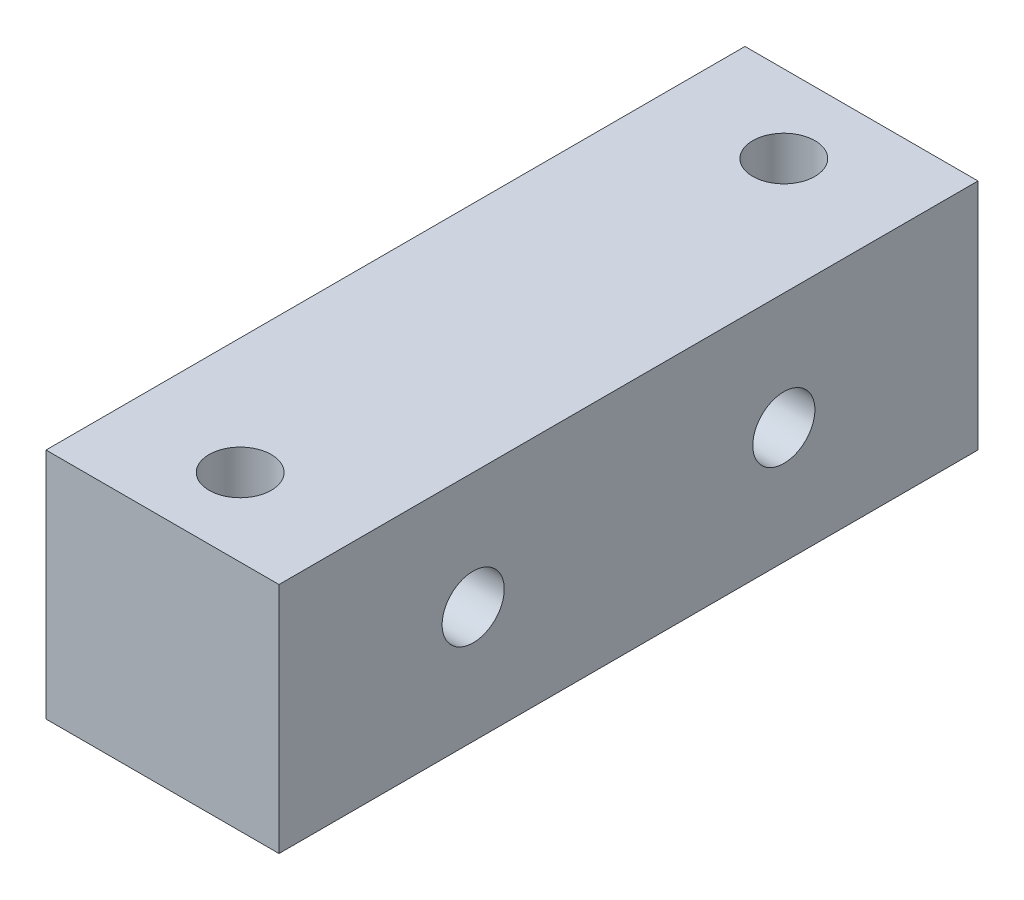
ISO-10303-21;
HEADER;
FILE_DESCRIPTION(('STEP AP214'),'2;1');
FILE_NAME('part.step','',(''),(''),'','','');
FILE_SCHEMA(('AUTOMOTIVE_DESIGN { 1 0 10303 214 1 1 1 1 }'));
ENDSEC;
DATA;
#1=APPLICATION_CONTEXT('core data for automotive mechanical design processes');
#2=APPLICATION_PROTOCOL_DEFINITION('international standard','automotive_design',2000,#1);
#3=PRODUCT_CONTEXT('',#1,'mechanical');
#4=PRODUCT('Part','Part','',(#3));
#5=PRODUCT_RELATED_PRODUCT_CATEGORY('part','',(#4));
#6=PRODUCT_DEFINITION_FORMATION('','',#4);
#7=PRODUCT_DEFINITION_CONTEXT('part definition',#1,'design');
#8=PRODUCT_DEFINITION('design','',#6,#7);
#9=PRODUCT_DEFINITION_SHAPE('','',#8);
#10=(LENGTH_UNIT() NAMED_UNIT(*) SI_UNIT(.MILLI.,.METRE.));
#11=(NAMED_UNIT(*) PLANE_ANGLE_UNIT() SI_UNIT($,.RADIAN.));
#12=(NAMED_UNIT(*) SI_UNIT($,.STERADIAN.) SOLID_ANGLE_UNIT());
#13=UNCERTAINTY_MEASURE_WITH_UNIT(LENGTH_MEASURE(1.E-05),#10,'distance_accuracy_value','');
#14=(GEOMETRIC_REPRESENTATION_CONTEXT(3) GLOBAL_UNCERTAINTY_ASSIGNED_CONTEXT((#13)) GLOBAL_UNIT_ASSIGNED_CONTEXT((#10,
#11,#12)) REPRESENTATION_CONTEXT('',''));
#15=CARTESIAN_POINT('',(0.,0.,0.));
#16=DIRECTION('',(0.,0.,1.));
#17=DIRECTION('',(1.,0.,0.));
#18=AXIS2_PLACEMENT_3D('',#15,#16,#17);
#19=CARTESIAN_POINT('',(15.,30.,45.));
#20=DIRECTION('',(-1.,0.,0.));
#21=DIRECTION('',(0.,0.,1.));
#22=AXIS2_PLACEMENT_3D('',#19,#20,#21);
#23=PLANE('',#22);
#24=CARTESIAN_POINT('',(15.,15.,-20.));
#25=DIRECTION('',(-1.,0.,0.));
#26=DIRECTION('',(0.,0.,1.));
#27=AXIS2_PLACEMENT_3D('',#24,#25,#26);
#28=CIRCLE('',#27,4.);
#29=CARTESIAN_POINT('',(15.,15.,-16.));
#30=VERTEX_POINT('',#29);
#31=EDGE_CURVE('E111',#30,#30,#28,.T.);
#32=ORIENTED_EDGE('',*,*,#31,.T.);
#33=EDGE_LOOP('',(#32));
#34=FACE_BOUND('',#33,.T.);
#35=CARTESIAN_POINT('',(15.,15.,20.));
#36=DIRECTION('',(-1.,0.,0.));
#37=DIRECTION('',(0.,0.,-1.));
#38=AXIS2_PLACEMENT_3D('',#35,#36,#37);
#39=CIRCLE('',#38,4.);
#40=CARTESIAN_POINT('',(15.,15.,24.));
#41=VERTEX_POINT('',#40);
#42=EDGE_CURVE('E132',#41,#41,#39,.T.);
#43=ORIENTED_EDGE('',*,*,#42,.T.);
#44=EDGE_LOOP('',(#43));
#45=FACE_BOUND('',#44,.T.);
#46=DIRECTION('',(0.,0.,-1.));
#47=VECTOR('',#46,1.);
#48=CARTESIAN_POINT('',(15.,0.,45.));
#49=LINE('',#48,#47);
#50=CARTESIAN_POINT('',(15.,0.,45.));
#51=VERTEX_POINT('',#50);
#52=CARTESIAN_POINT('',(15.,0.,-45.));
#53=VERTEX_POINT('',#52);
#54=EDGE_CURVE('E107',#51,#53,#49,.T.);
#55=ORIENTED_EDGE('',*,*,#54,.T.);
#56=DIRECTION('',(0.,-1.,0.));
#57=VECTOR('',#56,1.);
#58=CARTESIAN_POINT('',(15.,30.,-45.));
#59=LINE('',#58,#57);
#60=CARTESIAN_POINT('',(15.,30.,-45.));
#61=VERTEX_POINT('',#60);
#62=EDGE_CURVE('E11',#61,#53,#59,.T.);
#63=ORIENTED_EDGE('',*,*,#62,.F.);
#64=DIRECTION('',(0.,0.,-1.));
#65=VECTOR('',#64,1.);
#66=CARTESIAN_POINT('',(15.,30.,45.));
#67=LINE('',#66,#65);
#68=CARTESIAN_POINT('',(15.,30.,45.));
#69=VERTEX_POINT('',#68);
#70=EDGE_CURVE('E91',#69,#61,#67,.T.);
#71=ORIENTED_EDGE('',*,*,#70,.F.);
#72=DIRECTION('',(0.,-1.,0.));
#73=VECTOR('',#72,1.);
#74=CARTESIAN_POINT('',(15.,30.,45.));
#75=LINE('',#74,#73);
#76=EDGE_CURVE('E103',#69,#51,#75,.T.);
#77=ORIENTED_EDGE('',*,*,#76,.T.);
#78=EDGE_LOOP('',(#55,#63,#71,#77));
#79=FACE_BOUND('',#78,.T.);
#80=ADVANCED_FACE('F39',(#34,#45,#79),#23,.F.);
#81=CARTESIAN_POINT('',(-15.,30.,-45.));
#82=DIRECTION('',(0.,0.,1.));
#83=DIRECTION('',(1.,0.,0.));
#84=AXIS2_PLACEMENT_3D('',#81,#82,#83);
#85=PLANE('',#84);
#86=DIRECTION('',(-1.,0.,0.));
#87=VECTOR('',#86,1.);
#88=CARTESIAN_POINT('',(-15.,0.,-45.));
#89=LINE('',#88,#87);
#90=CARTESIAN_POINT('',(-15.,0.,-45.));
#91=VERTEX_POINT('',#90);
#92=EDGE_CURVE('E96',#53,#91,#89,.T.);
#93=ORIENTED_EDGE('',*,*,#92,.T.);
#94=DIRECTION('',(0.,-1.,0.));
#95=VECTOR('',#94,1.);
#96=CARTESIAN_POINT('',(-15.,30.,-45.));
#97=LINE('',#96,#95);
#98=CARTESIAN_POINT('',(-15.,30.,-45.));
#99=VERTEX_POINT('',#98);
#100=EDGE_CURVE('E48',#99,#91,#97,.T.);
#101=ORIENTED_EDGE('',*,*,#100,.F.);
#102=DIRECTION('',(-1.,0.,0.));
#103=VECTOR('',#102,1.);
#104=CARTESIAN_POINT('',(-15.,30.,-45.));
#105=LINE('',#104,#103);
#106=EDGE_CURVE('E86',#61,#99,#105,.T.);
#107=ORIENTED_EDGE('',*,*,#106,.F.);
#108=ORIENTED_EDGE('',*,*,#62,.T.);
#109=EDGE_LOOP('',(#93,#101,#107,#108));
#110=FACE_BOUND('',#109,.T.);
#111=ADVANCED_FACE('F95',(#110),#85,.F.);
#112=CARTESIAN_POINT('',(-15.,30.,45.));
#113=DIRECTION('',(1.,0.,0.));
#114=DIRECTION('',(0.,0.,-1.));
#115=AXIS2_PLACEMENT_3D('',#112,#113,#114);
#116=PLANE('',#115);
#117=CARTESIAN_POINT('',(-15.,15.,-20.));
#118=DIRECTION('',(-1.,0.,0.));
#119=DIRECTION('',(0.,0.,1.));
#120=AXIS2_PLACEMENT_3D('',#117,#118,#119);
#121=CIRCLE('',#120,4.);
#122=CARTESIAN_POINT('',(-15.,15.,-16.));
#123=VERTEX_POINT('',#122);
#124=EDGE_CURVE('E137',#123,#123,#121,.T.);
#125=ORIENTED_EDGE('',*,*,#124,.F.);
#126=EDGE_LOOP('',(#125));
#127=FACE_BOUND('',#126,.T.);
#128=CARTESIAN_POINT('',(-15.,15.,20.));
#129=DIRECTION('',(-1.,0.,0.));
#130=DIRECTION('',(0.,0.,-1.));
#131=AXIS2_PLACEMENT_3D('',#128,#129,#130);
#132=CIRCLE('',#131,4.);
#133=CARTESIAN_POINT('',(-15.,15.,24.));
#134=VERTEX_POINT('',#133);
#135=EDGE_CURVE('E128',#134,#134,#132,.T.);
#136=ORIENTED_EDGE('',*,*,#135,.F.);
#137=EDGE_LOOP('',(#136));
#138=FACE_BOUND('',#137,.T.);
#139=DIRECTION('',(0.,0.,1.));
#140=VECTOR('',#139,1.);
#141=CARTESIAN_POINT('',(-15.,0.,45.));
#142=LINE('',#141,#140);
#143=CARTESIAN_POINT('',(-15.,0.,45.));
#144=VERTEX_POINT('',#143);
#145=EDGE_CURVE('E73',#91,#144,#142,.T.);
#146=ORIENTED_EDGE('',*,*,#145,.T.);
#147=DIRECTION('',(0.,-1.,0.));
#148=VECTOR('',#147,1.);
#149=CARTESIAN_POINT('',(-15.,30.,45.));
#150=LINE('',#149,#148);
#151=CARTESIAN_POINT('',(-15.,30.,45.));
#152=VERTEX_POINT('',#151);
#153=EDGE_CURVE('E98',#152,#144,#150,.T.);
#154=ORIENTED_EDGE('',*,*,#153,.F.);
#155=DIRECTION('',(0.,0.,1.));
#156=VECTOR('',#155,1.);
#157=CARTESIAN_POINT('',(-15.,30.,45.));
#158=LINE('',#157,#156);
#159=EDGE_CURVE('E89',#99,#152,#158,.T.);
#160=ORIENTED_EDGE('',*,*,#159,.F.);
#161=ORIENTED_EDGE('',*,*,#100,.T.);
#162=EDGE_LOOP('',(#146,#154,#160,#161));
#163=FACE_BOUND('',#162,.T.);
#164=ADVANCED_FACE('F99',(#127,#138,#163),#116,.F.);
#165=CARTESIAN_POINT('',(-15.,30.,45.));
#166=DIRECTION('',(0.,0.,-1.));
#167=DIRECTION('',(-1.,0.,0.));
#168=AXIS2_PLACEMENT_3D('',#165,#166,#167);
#169=PLANE('',#168);
#170=DIRECTION('',(1.,0.,0.));
#171=VECTOR('',#170,1.);
#172=CARTESIAN_POINT('',(-15.,0.,45.));
#173=LINE('',#172,#171);
#174=EDGE_CURVE('E79',#144,#51,#173,.T.);
#175=ORIENTED_EDGE('',*,*,#174,.T.);
#176=ORIENTED_EDGE('',*,*,#76,.F.);
#177=DIRECTION('',(1.,0.,0.));
#178=VECTOR('',#177,1.);
#179=CARTESIAN_POINT('',(-15.,30.,45.));
#180=LINE('',#179,#178);
#181=EDGE_CURVE('E56',#152,#69,#180,.T.);
#182=ORIENTED_EDGE('',*,*,#181,.F.);
#183=ORIENTED_EDGE('',*,*,#153,.T.);
#184=EDGE_LOOP('',(#175,#176,#182,#183));
#185=FACE_BOUND('',#184,.T.);
#186=ADVANCED_FACE('F121',(#185),#169,.F.);
#187=CARTESIAN_POINT('',(0.,30.,0.));
#188=DIRECTION('',(0.,-1.,0.));
#189=DIRECTION('',(0.,0.,-1.));
#190=AXIS2_PLACEMENT_3D('',#187,#188,#189);
#191=PLANE('',#190);
#192=CARTESIAN_POINT('',(0.,30.,-35.));
#193=DIRECTION('',(0.,1.,0.));
#194=DIRECTION('',(0.,0.,1.));
#195=AXIS2_PLACEMENT_3D('',#192,#193,#194);
#196=CIRCLE('',#195,4.);
#197=CARTESIAN_POINT('',(0.,30.,-31.));
#198=VERTEX_POINT('',#197);
#199=EDGE_CURVE('E152',#198,#198,#196,.T.);
#200=ORIENTED_EDGE('',*,*,#199,.F.);
#201=EDGE_LOOP('',(#200));
#202=FACE_BOUND('',#201,.T.);
#203=CARTESIAN_POINT('',(0.,30.,35.));
#204=DIRECTION('',(0.,1.,0.));
#205=DIRECTION('',(0.,0.,-1.));
#206=AXIS2_PLACEMENT_3D('',#203,#204,#205);
#207=CIRCLE('',#206,4.);
#208=CARTESIAN_POINT('',(0.,30.,31.));
#209=VERTEX_POINT('',#208);
#210=EDGE_CURVE('E144',#209,#209,#207,.T.);
#211=ORIENTED_EDGE('',*,*,#210,.F.);
#212=EDGE_LOOP('',(#211));
#213=FACE_BOUND('',#212,.T.);
#214=ORIENTED_EDGE('',*,*,#70,.T.);
#215=ORIENTED_EDGE('',*,*,#106,.T.);
#216=ORIENTED_EDGE('',*,*,#159,.T.);
#217=ORIENTED_EDGE('',*,*,#181,.T.);
#218=EDGE_LOOP('',(#214,#215,#216,#217));
#219=FACE_BOUND('',#218,.T.);
#220=ADVANCED_FACE('F87',(#202,#213,#219),#191,.F.);
#221=CARTESIAN_POINT('',(0.,0.,0.));
#222=DIRECTION('',(0.,-1.,0.));
#223=DIRECTION('',(0.,0.,-1.));
#224=AXIS2_PLACEMENT_3D('',#221,#222,#223);
#225=PLANE('',#224);
#226=CARTESIAN_POINT('',(0.,0.,-35.));
#227=DIRECTION('',(0.,1.,0.));
#228=DIRECTION('',(0.,0.,1.));
#229=AXIS2_PLACEMENT_3D('',#226,#227,#228);
#230=CIRCLE('',#229,4.);
#231=CARTESIAN_POINT('',(0.,0.,-31.));
#232=VERTEX_POINT('',#231);
#233=EDGE_CURVE('E133',#232,#232,#230,.T.);
#234=ORIENTED_EDGE('',*,*,#233,.T.);
#235=EDGE_LOOP('',(#234));
#236=FACE_BOUND('',#235,.T.);
#237=CARTESIAN_POINT('',(0.,0.,35.));
#238=DIRECTION('',(0.,1.,0.));
#239=DIRECTION('',(0.,0.,-1.));
#240=AXIS2_PLACEMENT_3D('',#237,#238,#239);
#241=CIRCLE('',#240,4.);
#242=CARTESIAN_POINT('',(0.,0.,31.));
#243=VERTEX_POINT('',#242);
#244=EDGE_CURVE('E148',#243,#243,#241,.T.);
#245=ORIENTED_EDGE('',*,*,#244,.T.);
#246=EDGE_LOOP('',(#245));
#247=FACE_BOUND('',#246,.T.);
#248=ORIENTED_EDGE('',*,*,#54,.F.);
#249=ORIENTED_EDGE('',*,*,#174,.F.);
#250=ORIENTED_EDGE('',*,*,#145,.F.);
#251=ORIENTED_EDGE('',*,*,#92,.F.);
#252=EDGE_LOOP('',(#248,#249,#250,#251));
#253=FACE_BOUND('',#252,.T.);
#254=ADVANCED_FACE('F124',(#236,#247,#253),#225,.T.);
#255=CARTESIAN_POINT('',(15.,15.,20.));
#256=DIRECTION('',(-1.,0.,0.));
#257=DIRECTION('',(0.,0.,1.));
#258=AXIS2_PLACEMENT_3D('',#255,#256,#257);
#259=CYLINDRICAL_SURFACE('',#258,4.);
#260=CARTESIAN_POINT('',(15.,15.,24.));
#261=CARTESIAN_POINT('',(14.6875,15.,24.));
#262=CARTESIAN_POINT('',(14.375,15.,24.));
#263=CARTESIAN_POINT('',(13.75,15.,24.));
#264=CARTESIAN_POINT('',(13.4375,15.,24.));
#265=CARTESIAN_POINT('',(12.8125,15.,24.));
#266=CARTESIAN_POINT('',(12.5,15.,24.));
#267=CARTESIAN_POINT('',(11.875,15.,24.));
#268=CARTESIAN_POINT('',(11.5625,15.,24.));
#269=CARTESIAN_POINT('',(10.9375,15.,24.));
#270=CARTESIAN_POINT('',(10.625,15.,24.));
#271=CARTESIAN_POINT('',(10.,15.,24.));
#272=CARTESIAN_POINT('',(9.6875,15.,24.));
#273=CARTESIAN_POINT('',(9.0625,15.,24.));
#274=CARTESIAN_POINT('',(8.75,15.,24.));
#275=CARTESIAN_POINT('',(8.125,15.,24.));
#276=CARTESIAN_POINT('',(7.8125,15.,24.));
#277=CARTESIAN_POINT('',(7.1875,15.,24.));
#278=CARTESIAN_POINT('',(6.875,15.,24.));
#279=CARTESIAN_POINT('',(6.25,15.,24.));
#280=CARTESIAN_POINT('',(5.9375,15.,24.));
#281=CARTESIAN_POINT('',(5.3125,15.,24.));
#282=CARTESIAN_POINT('',(5.,15.,24.));
#283=CARTESIAN_POINT('',(4.375,15.,24.));
#284=CARTESIAN_POINT('',(4.06249999999999,15.,24.));
#285=CARTESIAN_POINT('',(3.43749999999999,15.,24.));
#286=CARTESIAN_POINT('',(3.125,15.,24.));
#287=CARTESIAN_POINT('',(2.5,15.,24.));
#288=CARTESIAN_POINT('',(2.1875,15.,24.));
#289=CARTESIAN_POINT('',(1.5625,15.,24.));
#290=CARTESIAN_POINT('',(1.25,15.,24.));
#291=CARTESIAN_POINT('',(0.624999999999995,15.,24.));
#292=CARTESIAN_POINT('',(0.312499999999995,15.,24.));
#293=CARTESIAN_POINT('',(-0.312500000000005,15.,24.));
#294=CARTESIAN_POINT('',(-0.625000000000005,15.,24.));
#295=CARTESIAN_POINT('',(-1.25,15.,24.));
#296=CARTESIAN_POINT('',(-1.5625,15.,24.));
#297=CARTESIAN_POINT('',(-2.1875,15.,24.));
#298=CARTESIAN_POINT('',(-2.5,15.,24.));
#299=CARTESIAN_POINT('',(-3.125,15.,24.));
#300=CARTESIAN_POINT('',(-3.4375,15.,24.));
#301=CARTESIAN_POINT('',(-4.0625,15.,24.));
#302=CARTESIAN_POINT('',(-4.375,15.,24.));
#303=CARTESIAN_POINT('',(-5.,15.,24.));
#304=CARTESIAN_POINT('',(-5.3125,15.,24.));
#305=CARTESIAN_POINT('',(-5.93750000000001,15.,24.));
#306=CARTESIAN_POINT('',(-6.25000000000001,15.,24.));
#307=CARTESIAN_POINT('',(-6.87500000000001,15.,24.));
#308=CARTESIAN_POINT('',(-7.18750000000001,15.,24.));
#309=CARTESIAN_POINT('',(-7.81250000000001,15.,24.));
#310=CARTESIAN_POINT('',(-8.12500000000001,15.,24.));
#311=CARTESIAN_POINT('',(-8.75,15.,24.));
#312=CARTESIAN_POINT('',(-9.06250000000001,15.,24.));
#313=CARTESIAN_POINT('',(-9.68750000000001,15.,24.));
#314=CARTESIAN_POINT('',(-10.,15.,24.));
#315=CARTESIAN_POINT('',(-10.625,15.,24.));
#316=CARTESIAN_POINT('',(-10.9375,15.,24.));
#317=CARTESIAN_POINT('',(-11.5625,15.,24.));
#318=CARTESIAN_POINT('',(-11.875,15.,24.));
#319=CARTESIAN_POINT('',(-12.5,15.,24.));
#320=CARTESIAN_POINT('',(-12.8125,15.,24.));
#321=CARTESIAN_POINT('',(-13.4375,15.,24.));
#322=CARTESIAN_POINT('',(-13.75,15.,24.));
#323=CARTESIAN_POINT('',(-14.375,15.,24.));
#324=CARTESIAN_POINT('',(-14.6875,15.,24.));
#325=CARTESIAN_POINT('',(-15.,15.,24.));
#326=B_SPLINE_CURVE_WITH_KNOTS('',3,(#260,#261,#262,#263,#264,#265,#266,#267,#268,#269,#270,
#271,#272,#273,#274,#275,#276,#277,#278,#279,#280,#281,#282,#283,#284,#285,#286,#287,#288,#289,
#290,#291,#292,#293,#294,#295,#296,#297,#298,#299,#300,#301,#302,#303,#304,#305,#306,#307,#308,
#309,#310,#311,#312,#313,#314,#315,#316,#317,#318,#319,#320,#321,#322,#323,#324,#325),
.UNSPECIFIED.,.F.,.F.,(4,2,2,2,2,2,2,2,2,2,2,2,2,2,2,2,2,2,2,2,2,2,2,2,2,2,2,2,2,2,2,2,4),(0.,
0.937499999999999,1.875,2.8125,3.75,4.6875,5.625,6.5625,7.5,8.4375,9.375,10.3125,11.25,12.1875,
13.125,14.0625,15.,15.9375,16.875,17.8125,18.75,19.6875,20.625,21.5625,22.5,23.4375,24.375,
25.3125,26.25,27.1875,28.125,29.0625,30.),.UNSPECIFIED.);
#327=EDGE_CURVE('BSEAM181',#41,#134,#326,.T.);
#328=ORIENTED_EDGE('',*,*,#42,.F.);
#329=ORIENTED_EDGE('',*,*,#135,.T.);
#330=ORIENTED_EDGE('',*,*,#327,.T.);
#331=ORIENTED_EDGE('',*,*,#327,.F.);
#332=EDGE_LOOP('',(#328,#330,#329,#331));
#333=FACE_BOUND('',#332,.T.);
#334=ADVANCED_FACE('F181',(#333),#259,.F.);
#335=CARTESIAN_POINT('',(15.,15.,-20.));
#336=DIRECTION('',(-1.,0.,0.));
#337=DIRECTION('',(0.,0.,1.));
#338=AXIS2_PLACEMENT_3D('',#335,#336,#337);
#339=CYLINDRICAL_SURFACE('',#338,4.);
#340=CARTESIAN_POINT('',(15.,15.,-16.));
#341=CARTESIAN_POINT('',(14.6875,15.,-16.));
#342=CARTESIAN_POINT('',(14.375,15.,-16.));
#343=CARTESIAN_POINT('',(13.75,15.,-16.));
#344=CARTESIAN_POINT('',(13.4375,15.,-16.));
#345=CARTESIAN_POINT('',(12.8125,15.,-16.));
#346=CARTESIAN_POINT('',(12.5,15.,-16.));
#347=CARTESIAN_POINT('',(11.875,15.,-16.));
#348=CARTESIAN_POINT('',(11.5625,15.,-16.));
#349=CARTESIAN_POINT('',(10.9375,15.,-16.));
#350=CARTESIAN_POINT('',(10.625,15.,-16.));
#351=CARTESIAN_POINT('',(10.,15.,-16.));
#352=CARTESIAN_POINT('',(9.6875,15.,-16.));
#353=CARTESIAN_POINT('',(9.0625,15.,-16.));
#354=CARTESIAN_POINT('',(8.75,15.,-16.));
#355=CARTESIAN_POINT('',(8.125,15.,-16.));
#356=CARTESIAN_POINT('',(7.8125,15.,-16.));
#357=CARTESIAN_POINT('',(7.1875,15.,-16.));
#358=CARTESIAN_POINT('',(6.875,15.,-16.));
#359=CARTESIAN_POINT('',(6.25,15.,-16.));
#360=CARTESIAN_POINT('',(5.9375,15.,-16.));
#361=CARTESIAN_POINT('',(5.3125,15.,-16.));
#362=CARTESIAN_POINT('',(5.,15.,-16.));
#363=CARTESIAN_POINT('',(4.375,15.,-16.));
#364=CARTESIAN_POINT('',(4.06249999999999,15.,-16.));
#365=CARTESIAN_POINT('',(3.43749999999999,15.,-16.));
#366=CARTESIAN_POINT('',(3.125,15.,-16.));
#367=CARTESIAN_POINT('',(2.5,15.,-16.));
#368=CARTESIAN_POINT('',(2.1875,15.,-16.));
#369=CARTESIAN_POINT('',(1.5625,15.,-16.));
#370=CARTESIAN_POINT('',(1.25,15.,-16.));
#371=CARTESIAN_POINT('',(0.624999999999995,15.,-16.));
#372=CARTESIAN_POINT('',(0.312499999999995,15.,-16.));
#373=CARTESIAN_POINT('',(-0.312500000000005,15.,-16.));
#374=CARTESIAN_POINT('',(-0.625000000000005,15.,-16.));
#375=CARTESIAN_POINT('',(-1.25,15.,-16.));
#376=CARTESIAN_POINT('',(-1.5625,15.,-16.));
#377=CARTESIAN_POINT('',(-2.1875,15.,-16.));
#378=CARTESIAN_POINT('',(-2.5,15.,-16.));
#379=CARTESIAN_POINT('',(-3.125,15.,-16.));
#380=CARTESIAN_POINT('',(-3.4375,15.,-16.));
#381=CARTESIAN_POINT('',(-4.0625,15.,-16.));
#382=CARTESIAN_POINT('',(-4.375,15.,-16.));
#383=CARTESIAN_POINT('',(-5.,15.,-16.));
#384=CARTESIAN_POINT('',(-5.3125,15.,-16.));
#385=CARTESIAN_POINT('',(-5.93750000000001,15.,-16.));
#386=CARTESIAN_POINT('',(-6.25000000000001,15.,-16.));
#387=CARTESIAN_POINT('',(-6.87500000000001,15.,-16.));
#388=CARTESIAN_POINT('',(-7.18750000000001,15.,-16.));
#389=CARTESIAN_POINT('',(-7.81250000000001,15.,-16.));
#390=CARTESIAN_POINT('',(-8.12500000000001,15.,-16.));
#391=CARTESIAN_POINT('',(-8.75,15.,-16.));
#392=CARTESIAN_POINT('',(-9.06250000000001,15.,-16.));
#393=CARTESIAN_POINT('',(-9.68750000000001,15.,-16.));
#394=CARTESIAN_POINT('',(-10.,15.,-16.));
#395=CARTESIAN_POINT('',(-10.625,15.,-16.));
#396=CARTESIAN_POINT('',(-10.9375,15.,-16.));
#397=CARTESIAN_POINT('',(-11.5625,15.,-16.));
#398=CARTESIAN_POINT('',(-11.875,15.,-16.));
#399=CARTESIAN_POINT('',(-12.5,15.,-16.));
#400=CARTESIAN_POINT('',(-12.8125,15.,-16.));
#401=CARTESIAN_POINT('',(-13.4375,15.,-16.));
#402=CARTESIAN_POINT('',(-13.75,15.,-16.));
#403=CARTESIAN_POINT('',(-14.375,15.,-16.));
#404=CARTESIAN_POINT('',(-14.6875,15.,-16.));
#405=CARTESIAN_POINT('',(-15.,15.,-16.));
#406=B_SPLINE_CURVE_WITH_KNOTS('',3,(#340,#341,#342,#343,#344,#345,#346,#347,#348,#349,#350,
#351,#352,#353,#354,#355,#356,#357,#358,#359,#360,#361,#362,#363,#364,#365,#366,#367,#368,#369,
#370,#371,#372,#373,#374,#375,#376,#377,#378,#379,#380,#381,#382,#383,#384,#385,#386,#387,#388,
#389,#390,#391,#392,#393,#394,#395,#396,#397,#398,#399,#400,#401,#402,#403,#404,#405),
.UNSPECIFIED.,.F.,.F.,(4,2,2,2,2,2,2,2,2,2,2,2,2,2,2,2,2,2,2,2,2,2,2,2,2,2,2,2,2,2,2,2,4),(0.,
0.937499999999999,1.875,2.8125,3.75,4.6875,5.625,6.5625,7.5,8.4375,9.375,10.3125,11.25,12.1875,
13.125,14.0625,15.,15.9375,16.875,17.8125,18.75,19.6875,20.625,21.5625,22.5,23.4375,24.375,
25.3125,26.25,27.1875,28.125,29.0625,30.),.UNSPECIFIED.);
#407=EDGE_CURVE('BSEAM175',#30,#123,#406,.T.);
#408=ORIENTED_EDGE('',*,*,#31,.F.);
#409=ORIENTED_EDGE('',*,*,#124,.T.);
#410=ORIENTED_EDGE('',*,*,#407,.T.);
#411=ORIENTED_EDGE('',*,*,#407,.F.);
#412=EDGE_LOOP('',(#408,#410,#409,#411));
#413=FACE_BOUND('',#412,.T.);
#414=ADVANCED_FACE('F175',(#413),#339,.F.);
#415=CARTESIAN_POINT('',(0.,0.,35.));
#416=DIRECTION('',(0.,1.,0.));
#417=DIRECTION('',(0.,0.,1.));
#418=AXIS2_PLACEMENT_3D('',#415,#416,#417);
#419=CYLINDRICAL_SURFACE('',#418,4.);
#420=ORIENTED_EDGE('',*,*,#244,.F.);
#421=EDGE_LOOP('',(#420));
#422=FACE_BOUND('',#421,.T.);
#423=ORIENTED_EDGE('',*,*,#210,.T.);
#424=EDGE_LOOP('',(#423));
#425=FACE_BOUND('',#424,.T.);
#426=ADVANCED_FACE('F165',(#422,#425),#419,.F.);
#427=CARTESIAN_POINT('',(0.,0.,-35.));
#428=DIRECTION('',(0.,1.,0.));
#429=DIRECTION('',(0.,0.,1.));
#430=AXIS2_PLACEMENT_3D('',#427,#428,#429);
#431=CYLINDRICAL_SURFACE('',#430,4.);
#432=ORIENTED_EDGE('',*,*,#233,.F.);
#433=EDGE_LOOP('',(#432));
#434=FACE_BOUND('',#433,.T.);
#435=ORIENTED_EDGE('',*,*,#199,.T.);
#436=EDGE_LOOP('',(#435));
#437=FACE_BOUND('',#436,.T.);
#438=ADVANCED_FACE('F162',(#434,#437),#431,.F.);
#439=CLOSED_SHELL('',(#80,#111,#164,#186,#220,#254,#334,#414,#426,#438));
#440=MANIFOLD_SOLID_BREP('B2',#439);
#441=ADVANCED_BREP_SHAPE_REPRESENTATION('',(#18,#440),#14);
#442=SHAPE_DEFINITION_REPRESENTATION(#9,#441);
ENDSEC;
END-ISO-10303-21;
